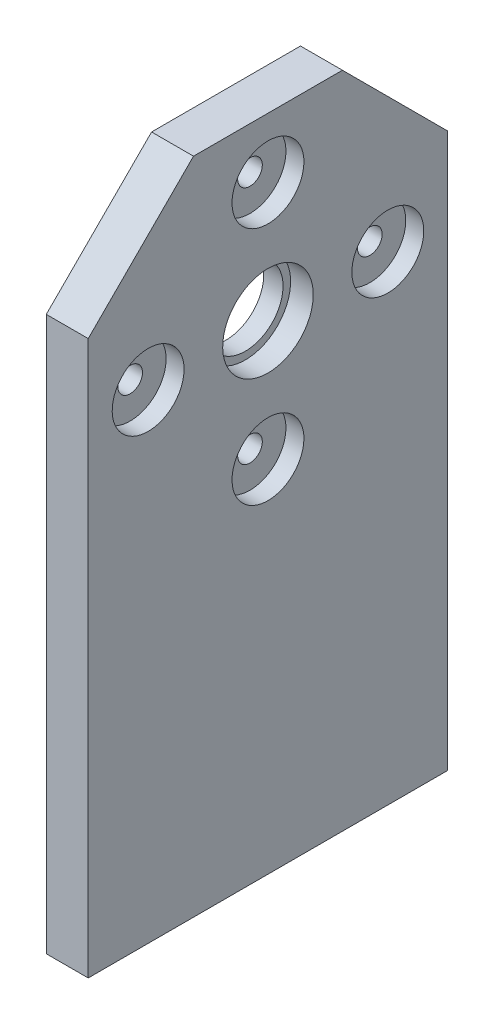
ISO-10303-21;
HEADER;
FILE_DESCRIPTION(('STEP AP214'),'2;1');
FILE_NAME('part.step','',(''),(''),'','','');
FILE_SCHEMA(('AUTOMOTIVE_DESIGN { 1 0 10303 214 1 1 1 1 }'));
ENDSEC;
DATA;
#1=APPLICATION_CONTEXT('core data for automotive mechanical design processes');
#2=APPLICATION_PROTOCOL_DEFINITION('international standard','automotive_design',2000,#1);
#3=PRODUCT_CONTEXT('',#1,'mechanical');
#4=PRODUCT('Part','Part','',(#3));
#5=PRODUCT_RELATED_PRODUCT_CATEGORY('part','',(#4));
#6=PRODUCT_DEFINITION_FORMATION('','',#4);
#7=PRODUCT_DEFINITION_CONTEXT('part definition',#1,'design');
#8=PRODUCT_DEFINITION('design','',#6,#7);
#9=PRODUCT_DEFINITION_SHAPE('','',#8);
#10=(LENGTH_UNIT() NAMED_UNIT(*) SI_UNIT(.MILLI.,.METRE.));
#11=(NAMED_UNIT(*) PLANE_ANGLE_UNIT() SI_UNIT($,.RADIAN.));
#12=(NAMED_UNIT(*) SI_UNIT($,.STERADIAN.) SOLID_ANGLE_UNIT());
#13=UNCERTAINTY_MEASURE_WITH_UNIT(LENGTH_MEASURE(1.E-05),#10,'distance_accuracy_value','');
#14=(GEOMETRIC_REPRESENTATION_CONTEXT(3) GLOBAL_UNCERTAINTY_ASSIGNED_CONTEXT((#13)) GLOBAL_UNIT_ASSIGNED_CONTEXT((#10,
#11,#12)) REPRESENTATION_CONTEXT('',''));
#15=CARTESIAN_POINT('',(0.,0.,0.));
#16=DIRECTION('',(0.,0.,1.));
#17=DIRECTION('',(1.,0.,0.));
#18=AXIS2_PLACEMENT_3D('',#15,#16,#17);
#19=CARTESIAN_POINT('',(-29.15,0.,-11.));
#20=DIRECTION('',(-1.,0.,0.));
#21=DIRECTION('',(0.,0.,-1.));
#22=AXIS2_PLACEMENT_3D('',#19,#20,#21);
#23=PLANE('',#22);
#24=CARTESIAN_POINT('',(-29.15,-31.75,-3.17356640186013E-13));
#25=DIRECTION('',(-1.,0.,0.));
#26=DIRECTION('',(0.,0.,1.));
#27=AXIS2_PLACEMENT_3D('',#24,#25,#26);
#28=CIRCLE('',#27,3.2639);
#29=CARTESIAN_POINT('',(-29.15,-31.75,3.26389999999968));
#30=VERTEX_POINT('',#29);
#31=EDGE_CURVE('E172',#30,#30,#28,.T.);
#32=ORIENTED_EDGE('',*,*,#31,.F.);
#33=EDGE_LOOP('',(#32));
#34=FACE_BOUND('',#33,.T.);
#35=CARTESIAN_POINT('',(-29.15,-1.80042903274088E-13,31.75));
#36=DIRECTION('',(-1.,0.,0.));
#37=DIRECTION('',(0.,0.,1.));
#38=AXIS2_PLACEMENT_3D('',#35,#36,#37);
#39=CIRCLE('',#38,3.2639);
#40=CARTESIAN_POINT('',(-29.15,-1.80042903274088E-13,35.0139));
#41=VERTEX_POINT('',#40);
#42=EDGE_CURVE('E161',#41,#41,#39,.T.);
#43=ORIENTED_EDGE('',*,*,#42,.F.);
#44=EDGE_LOOP('',(#43));
#45=FACE_BOUND('',#44,.T.);
#46=CARTESIAN_POINT('',(-29.15,0.,-31.75));
#47=DIRECTION('',(-1.,0.,0.));
#48=DIRECTION('',(0.,0.,1.));
#49=AXIS2_PLACEMENT_3D('',#46,#47,#48);
#50=CIRCLE('',#49,3.2639);
#51=CARTESIAN_POINT('',(-29.15,0.,-28.4861));
#52=VERTEX_POINT('',#51);
#53=EDGE_CURVE('E156',#52,#52,#50,.T.);
#54=ORIENTED_EDGE('',*,*,#53,.F.);
#55=EDGE_LOOP('',(#54));
#56=FACE_BOUND('',#55,.T.);
#57=CARTESIAN_POINT('',(-29.15,31.75,1.39965040338801E-13));
#58=DIRECTION('',(-1.,0.,0.));
#59=DIRECTION('',(0.,0.,1.));
#60=AXIS2_PLACEMENT_3D('',#57,#58,#59);
#61=CIRCLE('',#60,3.2639);
#62=CARTESIAN_POINT('',(-29.15,31.75,3.26390000000014));
#63=VERTEX_POINT('',#62);
#64=EDGE_CURVE('E152',#63,#63,#61,.T.);
#65=ORIENTED_EDGE('',*,*,#64,.F.);
#66=EDGE_LOOP('',(#65));
#67=FACE_BOUND('',#66,.T.);
#68=CARTESIAN_POINT('',(-29.15,0.,0.));
#69=DIRECTION('',(1.,0.,0.));
#70=DIRECTION('',(0.,1.,0.));
#71=AXIS2_PLACEMENT_3D('',#68,#69,#70);
#72=CIRCLE('',#71,10.);
#73=CARTESIAN_POINT('',(-29.15,10.,0.));
#74=VERTEX_POINT('',#73);
#75=EDGE_CURVE('E165',#74,#74,#72,.T.);
#76=ORIENTED_EDGE('',*,*,#75,.T.);
#77=EDGE_LOOP('',(#76));
#78=FACE_BOUND('',#77,.T.);
#79=DIRECTION('',(0.,0.,-1.));
#80=VECTOR('',#79,1.);
#81=CARTESIAN_POINT('',(-29.15,-127.,-47.625));
#82=LINE('',#81,#80);
#83=CARTESIAN_POINT('',(-29.15,-127.,47.625));
#84=VERTEX_POINT('',#83);
#85=CARTESIAN_POINT('',(-29.15,-127.,-47.6249999999999));
#86=VERTEX_POINT('',#85);
#87=EDGE_CURVE('E50',#84,#86,#82,.T.);
#88=ORIENTED_EDGE('',*,*,#87,.F.);
#89=DIRECTION('',(0.,-1.,0.));
#90=VECTOR('',#89,1.);
#91=CARTESIAN_POINT('',(-29.15,-127.,47.625));
#92=LINE('',#91,#90);
#93=CARTESIAN_POINT('',(-29.15,19.7269209080182,47.625));
#94=VERTEX_POINT('',#93);
#95=EDGE_CURVE('E127',#94,#84,#92,.T.);
#96=ORIENTED_EDGE('',*,*,#95,.F.);
#97=DIRECTION('',(0.,-0.707106781186551,0.707106781186544));
#98=VECTOR('',#97,1.);
#99=CARTESIAN_POINT('',(-29.15,19.7269209080182,47.6249999999999));
#100=LINE('',#99,#98);
#101=CARTESIAN_POINT('',(-29.15,47.6249999999998,19.7269209080187));
#102=VERTEX_POINT('',#101);
#103=EDGE_CURVE('E131',#102,#94,#100,.T.);
#104=ORIENTED_EDGE('',*,*,#103,.F.);
#105=DIRECTION('',(0.,0.,1.));
#106=VECTOR('',#105,1.);
#107=CARTESIAN_POINT('',(-29.15,47.6249999999998,19.7269209080186));
#108=LINE('',#107,#106);
#109=CARTESIAN_POINT('',(-29.15,47.6249999999998,-19.7269209080187));
#110=VERTEX_POINT('',#109);
#111=EDGE_CURVE('E80',#110,#102,#108,.T.);
#112=ORIENTED_EDGE('',*,*,#111,.F.);
#113=DIRECTION('',(0.,0.707106781186551,0.707106781186544));
#114=VECTOR('',#113,1.);
#115=CARTESIAN_POINT('',(-29.15,47.6249999999997,-19.7269209080187));
#116=LINE('',#115,#114);
#117=CARTESIAN_POINT('',(-29.15,19.7269209080182,-47.625));
#118=VERTEX_POINT('',#117);
#119=EDGE_CURVE('E85',#118,#110,#116,.T.);
#120=ORIENTED_EDGE('',*,*,#119,.F.);
#121=DIRECTION('',(0.,1.,0.));
#122=VECTOR('',#121,1.);
#123=CARTESIAN_POINT('',(-29.15,19.7269209080182,-47.625));
#124=LINE('',#123,#122);
#125=EDGE_CURVE('E106',#86,#118,#124,.T.);
#126=ORIENTED_EDGE('',*,*,#125,.F.);
#127=EDGE_LOOP('',(#88,#96,#104,#112,#120,#126));
#128=FACE_BOUND('',#127,.T.);
#129=ADVANCED_FACE('F41',(#34,#45,#56,#67,#78,#128),#23,.T.);
#130=CARTESIAN_POINT('',(-18.0374999999999,0.,0.));
#131=DIRECTION('',(-1.,0.,0.));
#132=DIRECTION('',(0.,0.,1.));
#133=AXIS2_PLACEMENT_3D('',#130,#131,#132);
#134=PLANE('',#133);
#135=CARTESIAN_POINT('',(-18.0374999999999,-1.80042903274088E-13,31.75));
#136=DIRECTION('',(1.,0.,0.));
#137=DIRECTION('',(0.,1.,0.));
#138=AXIS2_PLACEMENT_3D('',#135,#136,#137);
#139=CIRCLE('',#138,9.525);
#140=CARTESIAN_POINT('',(-18.0374999999999,9.52499999999982,31.75));
#141=VERTEX_POINT('',#140);
#142=EDGE_CURVE('E334',#141,#141,#139,.T.);
#143=ORIENTED_EDGE('',*,*,#142,.F.);
#144=EDGE_LOOP('',(#143));
#145=FACE_BOUND('',#144,.T.);
#146=CARTESIAN_POINT('',(-18.0374999999999,31.75,1.32275707701698E-13));
#147=DIRECTION('',(1.,0.,0.));
#148=DIRECTION('',(0.,1.,0.));
#149=AXIS2_PLACEMENT_3D('',#146,#147,#148);
#150=CIRCLE('',#149,9.525);
#151=CARTESIAN_POINT('',(-18.0374999999999,41.275,1.32275707701698E-13));
#152=VERTEX_POINT('',#151);
#153=EDGE_CURVE('E337',#152,#152,#150,.T.);
#154=ORIENTED_EDGE('',*,*,#153,.F.);
#155=EDGE_LOOP('',(#154));
#156=FACE_BOUND('',#155,.T.);
#157=CARTESIAN_POINT('',(-18.0374999999999,0.,-31.75));
#158=DIRECTION('',(1.,0.,0.));
#159=DIRECTION('',(0.,1.,0.));
#160=AXIS2_PLACEMENT_3D('',#157,#158,#159);
#161=CIRCLE('',#160,9.525);
#162=CARTESIAN_POINT('',(-18.0374999999999,9.52500000000006,-31.75));
#163=VERTEX_POINT('',#162);
#164=EDGE_CURVE('E343',#163,#163,#161,.T.);
#165=ORIENTED_EDGE('',*,*,#164,.F.);
#166=EDGE_LOOP('',(#165));
#167=FACE_BOUND('',#166,.T.);
#168=CARTESIAN_POINT('',(-18.0374999999999,-31.75,-3.25045972823115E-13));
#169=DIRECTION('',(1.,0.,0.));
#170=DIRECTION('',(0.,1.,0.));
#171=AXIS2_PLACEMENT_3D('',#168,#169,#170);
#172=CIRCLE('',#171,9.525);
#173=CARTESIAN_POINT('',(-18.0374999999999,-22.225,-3.25045972823115E-13));
#174=VERTEX_POINT('',#173);
#175=EDGE_CURVE('E349',#174,#174,#172,.T.);
#176=ORIENTED_EDGE('',*,*,#175,.F.);
#177=EDGE_LOOP('',(#176));
#178=FACE_BOUND('',#177,.T.);
#179=CARTESIAN_POINT('',(-18.0374999999999,0.,0.));
#180=DIRECTION('',(1.,0.,0.));
#181=DIRECTION('',(0.,1.,0.));
#182=AXIS2_PLACEMENT_3D('',#179,#180,#181);
#183=CIRCLE('',#182,12.);
#184=CARTESIAN_POINT('',(-18.0374999999999,12.,0.));
#185=VERTEX_POINT('',#184);
#186=EDGE_CURVE('E168',#185,#185,#183,.T.);
#187=ORIENTED_EDGE('',*,*,#186,.F.);
#188=EDGE_LOOP('',(#187));
#189=FACE_BOUND('',#188,.T.);
#190=DIRECTION('',(0.,0.,-1.));
#191=VECTOR('',#190,1.);
#192=CARTESIAN_POINT('',(-18.0374999999999,-127.,-47.6249999999999));
#193=LINE('',#192,#191);
#194=CARTESIAN_POINT('',(-18.0374999999999,-127.,47.625));
#195=VERTEX_POINT('',#194);
#196=CARTESIAN_POINT('',(-18.0374999999999,-127.,-47.6249999999999));
#197=VERTEX_POINT('',#196);
#198=EDGE_CURVE('E117',#195,#197,#193,.T.);
#199=ORIENTED_EDGE('',*,*,#198,.T.);
#200=DIRECTION('',(0.,1.,0.));
#201=VECTOR('',#200,1.);
#202=CARTESIAN_POINT('',(-18.0374999999999,19.7269209080182,-47.625));
#203=LINE('',#202,#201);
#204=CARTESIAN_POINT('',(-18.0374999999999,19.7269209080182,-47.625));
#205=VERTEX_POINT('',#204);
#206=EDGE_CURVE('E104',#197,#205,#203,.T.);
#207=ORIENTED_EDGE('',*,*,#206,.T.);
#208=DIRECTION('',(0.,0.707106781186551,0.707106781186544));
#209=VECTOR('',#208,1.);
#210=CARTESIAN_POINT('',(-18.0374999999999,47.6249999999998,-19.7269209080187));
#211=LINE('',#210,#209);
#212=CARTESIAN_POINT('',(-18.0374999999999,47.6249999999998,-19.7269209080187));
#213=VERTEX_POINT('',#212);
#214=EDGE_CURVE('E109',#205,#213,#211,.T.);
#215=ORIENTED_EDGE('',*,*,#214,.T.);
#216=DIRECTION('',(0.,0.,1.));
#217=VECTOR('',#216,1.);
#218=CARTESIAN_POINT('',(-18.0374999999999,47.6249999999998,19.7269209080187));
#219=LINE('',#218,#217);
#220=CARTESIAN_POINT('',(-18.0374999999999,47.6249999999998,19.7269209080187));
#221=VERTEX_POINT('',#220);
#222=EDGE_CURVE('E113',#213,#221,#219,.T.);
#223=ORIENTED_EDGE('',*,*,#222,.T.);
#224=DIRECTION('',(0.,-0.707106781186551,0.707106781186544));
#225=VECTOR('',#224,1.);
#226=CARTESIAN_POINT('',(-18.0374999999999,19.7269209080182,47.625));
#227=LINE('',#226,#225);
#228=CARTESIAN_POINT('',(-18.0374999999999,19.7269209080182,47.625));
#229=VERTEX_POINT('',#228);
#230=EDGE_CURVE('E178',#221,#229,#227,.T.);
#231=ORIENTED_EDGE('',*,*,#230,.T.);
#232=DIRECTION('',(0.,-1.,0.));
#233=VECTOR('',#232,1.);
#234=CARTESIAN_POINT('',(-18.0374999999999,-127.,47.625));
#235=LINE('',#234,#233);
#236=EDGE_CURVE('E124',#229,#195,#235,.T.);
#237=ORIENTED_EDGE('',*,*,#236,.T.);
#238=EDGE_LOOP('',(#199,#207,#215,#223,#231,#237));
#239=FACE_BOUND('',#238,.T.);
#240=ADVANCED_FACE('F115',(#145,#156,#167,#178,#189,#239),#134,.F.);
#241=CARTESIAN_POINT('',(-228.063179867499,19.7269209080182,-47.625));
#242=DIRECTION('',(0.,0.,-1.));
#243=DIRECTION('',(0.,1.,0.));
#244=AXIS2_PLACEMENT_3D('',#241,#242,#243);
#245=PLANE('',#244);
#246=DIRECTION('',(1.,0.,0.));
#247=VECTOR('',#246,1.);
#248=CARTESIAN_POINT('',(-228.063179867499,-127.,-47.6249999999999));
#249=LINE('',#248,#247);
#250=EDGE_CURVE('E12',#86,#197,#249,.T.);
#251=ORIENTED_EDGE('',*,*,#250,.F.);
#252=ORIENTED_EDGE('',*,*,#125,.T.);
#253=DIRECTION('',(1.,0.,0.));
#254=VECTOR('',#253,1.);
#255=CARTESIAN_POINT('',(-228.063179867499,19.7269209080182,-47.625));
#256=LINE('',#255,#254);
#257=EDGE_CURVE('E101',#118,#205,#256,.T.);
#258=ORIENTED_EDGE('',*,*,#257,.T.);
#259=ORIENTED_EDGE('',*,*,#206,.F.);
#260=EDGE_LOOP('',(#251,#252,#258,#259));
#261=FACE_BOUND('',#260,.T.);
#262=ADVANCED_FACE('F102',(#261),#245,.T.);
#263=CARTESIAN_POINT('',(-228.063179867499,47.6249999999998,-19.7269209080187));
#264=DIRECTION('',(0.,0.707106781186544,-0.707106781186551));
#265=DIRECTION('',(0.,0.707106781186551,0.707106781186544));
#266=AXIS2_PLACEMENT_3D('',#263,#264,#265);
#267=PLANE('',#266);
#268=ORIENTED_EDGE('',*,*,#257,.F.);
#269=ORIENTED_EDGE('',*,*,#119,.T.);
#270=DIRECTION('',(1.,0.,0.));
#271=VECTOR('',#270,1.);
#272=CARTESIAN_POINT('',(-228.063179867499,47.6249999999998,-19.7269209080187));
#273=LINE('',#272,#271);
#274=EDGE_CURVE('E96',#110,#213,#273,.T.);
#275=ORIENTED_EDGE('',*,*,#274,.T.);
#276=ORIENTED_EDGE('',*,*,#214,.F.);
#277=EDGE_LOOP('',(#268,#269,#275,#276));
#278=FACE_BOUND('',#277,.T.);
#279=ADVANCED_FACE('F110',(#278),#267,.T.);
#280=CARTESIAN_POINT('',(-228.063179867499,47.6249999999998,19.7269209080187));
#281=DIRECTION('',(0.,1.,0.));
#282=DIRECTION('',(-1.,0.,0.));
#283=AXIS2_PLACEMENT_3D('',#280,#281,#282);
#284=PLANE('',#283);
#285=ORIENTED_EDGE('',*,*,#274,.F.);
#286=ORIENTED_EDGE('',*,*,#111,.T.);
#287=DIRECTION('',(1.,0.,0.));
#288=VECTOR('',#287,1.);
#289=CARTESIAN_POINT('',(-228.063179867499,47.6249999999998,19.7269209080187));
#290=LINE('',#289,#288);
#291=EDGE_CURVE('E134',#102,#221,#290,.T.);
#292=ORIENTED_EDGE('',*,*,#291,.T.);
#293=ORIENTED_EDGE('',*,*,#222,.F.);
#294=EDGE_LOOP('',(#285,#286,#292,#293));
#295=FACE_BOUND('',#294,.T.);
#296=ADVANCED_FACE('F183',(#295),#284,.T.);
#297=CARTESIAN_POINT('',(-228.063179867499,19.7269209080182,47.625));
#298=DIRECTION('',(0.,0.707106781186544,0.707106781186551));
#299=DIRECTION('',(0.,-0.707106781186551,0.707106781186544));
#300=AXIS2_PLACEMENT_3D('',#297,#298,#299);
#301=PLANE('',#300);
#302=ORIENTED_EDGE('',*,*,#291,.F.);
#303=ORIENTED_EDGE('',*,*,#103,.T.);
#304=DIRECTION('',(1.,0.,0.));
#305=VECTOR('',#304,1.);
#306=CARTESIAN_POINT('',(-228.063179867499,19.7269209080182,47.625));
#307=LINE('',#306,#305);
#308=EDGE_CURVE('E130',#94,#229,#307,.T.);
#309=ORIENTED_EDGE('',*,*,#308,.T.);
#310=ORIENTED_EDGE('',*,*,#230,.F.);
#311=EDGE_LOOP('',(#302,#303,#309,#310));
#312=FACE_BOUND('',#311,.T.);
#313=ADVANCED_FACE('F186',(#312),#301,.T.);
#314=CARTESIAN_POINT('',(-228.063179867499,-127.,47.625));
#315=DIRECTION('',(0.,0.,1.));
#316=DIRECTION('',(1.,0.,0.));
#317=AXIS2_PLACEMENT_3D('',#314,#315,#316);
#318=PLANE('',#317);
#319=ORIENTED_EDGE('',*,*,#308,.F.);
#320=ORIENTED_EDGE('',*,*,#95,.T.);
#321=DIRECTION('',(1.,0.,0.));
#322=VECTOR('',#321,1.);
#323=CARTESIAN_POINT('',(-228.063179867499,-127.,47.625));
#324=LINE('',#323,#322);
#325=EDGE_CURVE('E126',#84,#195,#324,.T.);
#326=ORIENTED_EDGE('',*,*,#325,.T.);
#327=ORIENTED_EDGE('',*,*,#236,.F.);
#328=EDGE_LOOP('',(#319,#320,#326,#327));
#329=FACE_BOUND('',#328,.T.);
#330=ADVANCED_FACE('F189',(#329),#318,.T.);
#331=CARTESIAN_POINT('',(-228.063179867499,-127.,-47.6249999999999));
#332=DIRECTION('',(0.,-1.,0.));
#333=DIRECTION('',(1.,0.,0.));
#334=AXIS2_PLACEMENT_3D('',#331,#332,#333);
#335=PLANE('',#334);
#336=CARTESIAN_POINT('',(-23.5937499999999,-127.,-38.1));
#337=DIRECTION('',(0.,-1.,0.));
#338=DIRECTION('',(1.,0.,0.));
#339=AXIS2_PLACEMENT_3D('',#336,#337,#338);
#340=CIRCLE('',#339,2.77812499999999);
#341=CARTESIAN_POINT('',(-20.8156249999999,-127.,-38.1));
#342=VERTEX_POINT('',#341);
#343=EDGE_CURVE('E323',#342,#342,#340,.T.);
#344=ORIENTED_EDGE('',*,*,#343,.F.);
#345=EDGE_LOOP('',(#344));
#346=FACE_BOUND('',#345,.T.);
#347=CARTESIAN_POINT('',(-23.59375,-127.,38.1));
#348=DIRECTION('',(0.,-1.,0.));
#349=DIRECTION('',(1.,0.,0.));
#350=AXIS2_PLACEMENT_3D('',#347,#348,#349);
#351=CIRCLE('',#350,2.77812499999999);
#352=CARTESIAN_POINT('',(-20.815625,-127.,38.1));
#353=VERTEX_POINT('',#352);
#354=EDGE_CURVE('E317',#353,#353,#351,.T.);
#355=ORIENTED_EDGE('',*,*,#354,.F.);
#356=EDGE_LOOP('',(#355));
#357=FACE_BOUND('',#356,.T.);
#358=CARTESIAN_POINT('',(-23.59375,-127.,0.));
#359=DIRECTION('',(0.,-1.,0.));
#360=DIRECTION('',(1.,0.,0.));
#361=AXIS2_PLACEMENT_3D('',#358,#359,#360);
#362=CIRCLE('',#361,2.778125);
#363=CARTESIAN_POINT('',(-20.815625,-127.,0.));
#364=VERTEX_POINT('',#363);
#365=EDGE_CURVE('E318',#364,#364,#362,.T.);
#366=ORIENTED_EDGE('',*,*,#365,.F.);
#367=EDGE_LOOP('',(#366));
#368=FACE_BOUND('',#367,.T.);
#369=ORIENTED_EDGE('',*,*,#325,.F.);
#370=ORIENTED_EDGE('',*,*,#87,.T.);
#371=ORIENTED_EDGE('',*,*,#250,.T.);
#372=ORIENTED_EDGE('',*,*,#198,.F.);
#373=EDGE_LOOP('',(#369,#370,#371,#372));
#374=FACE_BOUND('',#373,.T.);
#375=ADVANCED_FACE('F191',(#346,#357,#368,#374),#335,.T.);
#376=CARTESIAN_POINT('',(-24.0374999999999,0.,0.));
#377=DIRECTION('',(1.,0.,0.));
#378=DIRECTION('',(0.,1.,0.));
#379=AXIS2_PLACEMENT_3D('',#376,#377,#378);
#380=CYLINDRICAL_SURFACE('',#379,12.);
#381=CARTESIAN_POINT('',(-24.0374999999999,0.,0.));
#382=DIRECTION('',(1.,0.,0.));
#383=DIRECTION('',(0.,1.,0.));
#384=AXIS2_PLACEMENT_3D('',#381,#382,#383);
#385=CIRCLE('',#384,12.);
#386=CARTESIAN_POINT('',(-24.0374999999999,12.,0.));
#387=VERTEX_POINT('',#386);
#388=EDGE_CURVE('E119',#387,#387,#385,.T.);
#389=ORIENTED_EDGE('',*,*,#388,.F.);
#390=EDGE_LOOP('',(#389));
#391=FACE_BOUND('',#390,.T.);
#392=ORIENTED_EDGE('',*,*,#186,.T.);
#393=EDGE_LOOP('',(#392));
#394=FACE_BOUND('',#393,.T.);
#395=ADVANCED_FACE('F193',(#391,#394),#380,.F.);
#396=CARTESIAN_POINT('',(-24.0374999999999,0.,0.));
#397=DIRECTION('',(1.,0.,0.));
#398=DIRECTION('',(0.,1.,0.));
#399=AXIS2_PLACEMENT_3D('',#396,#397,#398);
#400=PLANE('',#399);
#401=CARTESIAN_POINT('',(-24.0374999999999,0.,0.));
#402=DIRECTION('',(1.,0.,0.));
#403=DIRECTION('',(0.,1.,0.));
#404=AXIS2_PLACEMENT_3D('',#401,#402,#403);
#405=CIRCLE('',#404,10.);
#406=CARTESIAN_POINT('',(-24.0374999999999,10.,0.));
#407=VERTEX_POINT('',#406);
#408=EDGE_CURVE('E169',#407,#407,#405,.T.);
#409=ORIENTED_EDGE('',*,*,#408,.F.);
#410=EDGE_LOOP('',(#409));
#411=FACE_BOUND('',#410,.T.);
#412=ORIENTED_EDGE('',*,*,#388,.T.);
#413=EDGE_LOOP('',(#412));
#414=FACE_BOUND('',#413,.T.);
#415=ADVANCED_FACE('F201',(#411,#414),#400,.T.);
#416=CARTESIAN_POINT('',(-29.15,0.,0.));
#417=DIRECTION('',(1.,0.,0.));
#418=DIRECTION('',(0.,1.,0.));
#419=AXIS2_PLACEMENT_3D('',#416,#417,#418);
#420=CYLINDRICAL_SURFACE('',#419,10.);
#421=ORIENTED_EDGE('',*,*,#75,.F.);
#422=EDGE_LOOP('',(#421));
#423=FACE_BOUND('',#422,.T.);
#424=ORIENTED_EDGE('',*,*,#408,.T.);
#425=EDGE_LOOP('',(#424));
#426=FACE_BOUND('',#425,.T.);
#427=ADVANCED_FACE('F227',(#423,#426),#420,.F.);
#428=CARTESIAN_POINT('',(-18.0374999999999,31.75,1.34582507492829E-13));
#429=DIRECTION('',(-1.,0.,0.));
#430=DIRECTION('',(0.,0.,1.));
#431=AXIS2_PLACEMENT_3D('',#428,#429,#430);
#432=CYLINDRICAL_SURFACE('',#431,3.2639);
#433=CARTESIAN_POINT('',(-22.8,31.75,1.3688930728396E-13));
#434=DIRECTION('',(-1.,0.,0.));
#435=DIRECTION('',(0.,0.,1.));
#436=AXIS2_PLACEMENT_3D('',#433,#434,#435);
#437=CIRCLE('',#436,3.2639);
#438=CARTESIAN_POINT('',(-22.8,31.75,3.26390000000014));
#439=VERTEX_POINT('',#438);
#440=EDGE_CURVE('E44',#439,#439,#437,.F.);
#441=ORIENTED_EDGE('',*,*,#440,.T.);
#442=EDGE_LOOP('',(#441));
#443=FACE_BOUND('',#442,.T.);
#444=ORIENTED_EDGE('',*,*,#64,.T.);
#445=EDGE_LOOP('',(#444));
#446=FACE_BOUND('',#445,.T.);
#447=ADVANCED_FACE('F229',(#443,#446),#432,.F.);
#448=CARTESIAN_POINT('',(-18.0374999999999,0.,-31.75));
#449=DIRECTION('',(-1.,0.,0.));
#450=DIRECTION('',(0.,0.,1.));
#451=AXIS2_PLACEMENT_3D('',#448,#449,#450);
#452=CYLINDRICAL_SURFACE('',#451,3.2639);
#453=CARTESIAN_POINT('',(-22.8,0.,-31.75));
#454=DIRECTION('',(-1.,0.,0.));
#455=DIRECTION('',(0.,0.,1.));
#456=AXIS2_PLACEMENT_3D('',#453,#454,#455);
#457=CIRCLE('',#456,3.2639);
#458=CARTESIAN_POINT('',(-22.8,0.,-28.4861));
#459=VERTEX_POINT('',#458);
#460=EDGE_CURVE('E147',#459,#459,#457,.F.);
#461=ORIENTED_EDGE('',*,*,#460,.T.);
#462=EDGE_LOOP('',(#461));
#463=FACE_BOUND('',#462,.T.);
#464=ORIENTED_EDGE('',*,*,#53,.T.);
#465=EDGE_LOOP('',(#464));
#466=FACE_BOUND('',#465,.T.);
#467=ADVANCED_FACE('F245',(#463,#466),#452,.F.);
#468=CARTESIAN_POINT('',(-18.0374999999999,-1.80042903274088E-13,31.75));
#469=DIRECTION('',(-1.,0.,0.));
#470=DIRECTION('',(0.,0.,1.));
#471=AXIS2_PLACEMENT_3D('',#468,#469,#470);
#472=CYLINDRICAL_SURFACE('',#471,3.2639);
#473=CARTESIAN_POINT('',(-22.8,-1.80042903274088E-13,31.75));
#474=DIRECTION('',(-1.,0.,0.));
#475=DIRECTION('',(0.,0.,1.));
#476=AXIS2_PLACEMENT_3D('',#473,#474,#475);
#477=CIRCLE('',#476,3.2639);
#478=CARTESIAN_POINT('',(-22.8,-1.80042903274088E-13,35.0139));
#479=VERTEX_POINT('',#478);
#480=EDGE_CURVE('E144',#479,#479,#477,.F.);
#481=ORIENTED_EDGE('',*,*,#480,.T.);
#482=EDGE_LOOP('',(#481));
#483=FACE_BOUND('',#482,.T.);
#484=ORIENTED_EDGE('',*,*,#42,.T.);
#485=EDGE_LOOP('',(#484));
#486=FACE_BOUND('',#485,.T.);
#487=ADVANCED_FACE('F248',(#483,#486),#472,.F.);
#488=CARTESIAN_POINT('',(-18.0374999999999,-31.75,-3.22739173031985E-13));
#489=DIRECTION('',(-1.,0.,0.));
#490=DIRECTION('',(0.,0.,1.));
#491=AXIS2_PLACEMENT_3D('',#488,#489,#490);
#492=CYLINDRICAL_SURFACE('',#491,3.2639);
#493=CARTESIAN_POINT('',(-22.8,-31.75,-3.20432373240854E-13));
#494=DIRECTION('',(-1.,0.,0.));
#495=DIRECTION('',(0.,0.,1.));
#496=AXIS2_PLACEMENT_3D('',#493,#494,#495);
#497=CIRCLE('',#496,3.2639);
#498=CARTESIAN_POINT('',(-22.8,-31.75,3.26389999999968));
#499=VERTEX_POINT('',#498);
#500=EDGE_CURVE('E141',#499,#499,#497,.F.);
#501=ORIENTED_EDGE('',*,*,#500,.T.);
#502=EDGE_LOOP('',(#501));
#503=FACE_BOUND('',#502,.T.);
#504=ORIENTED_EDGE('',*,*,#31,.T.);
#505=EDGE_LOOP('',(#504));
#506=FACE_BOUND('',#505,.T.);
#507=ADVANCED_FACE('F251',(#503,#506),#492,.F.);
#508=CARTESIAN_POINT('',(-22.8,0.,-11.));
#509=DIRECTION('',(-1.,0.,0.));
#510=DIRECTION('',(0.,0.,-1.));
#511=AXIS2_PLACEMENT_3D('',#508,#509,#510);
#512=PLANE('',#511);
#513=CARTESIAN_POINT('',(-22.8,-31.75,-3.25045972823115E-13));
#514=DIRECTION('',(-1.,0.,0.));
#515=DIRECTION('',(0.,0.,1.));
#516=AXIS2_PLACEMENT_3D('',#513,#514,#515);
#517=CIRCLE('',#516,9.525);
#518=CARTESIAN_POINT('',(-22.8,-31.75,9.52499999999968));
#519=VERTEX_POINT('',#518);
#520=EDGE_CURVE('E332',#519,#519,#517,.F.);
#521=ORIENTED_EDGE('',*,*,#520,.T.);
#522=EDGE_LOOP('',(#521));
#523=FACE_BOUND('',#522,.T.);
#524=ORIENTED_EDGE('',*,*,#500,.F.);
#525=EDGE_LOOP('',(#524));
#526=FACE_BOUND('',#525,.T.);
#527=ADVANCED_FACE('F255',(#523,#526),#512,.F.);
#528=CARTESIAN_POINT('',(-56.0907683632075,-31.75,-3.25045972823115E-13));
#529=DIRECTION('',(1.,0.,0.));
#530=DIRECTION('',(0.,1.,0.));
#531=AXIS2_PLACEMENT_3D('',#528,#529,#530);
#532=CYLINDRICAL_SURFACE('',#531,9.525);
#533=ORIENTED_EDGE('',*,*,#175,.T.);
#534=EDGE_LOOP('',(#533));
#535=FACE_BOUND('',#534,.T.);
#536=ORIENTED_EDGE('',*,*,#520,.F.);
#537=EDGE_LOOP('',(#536));
#538=FACE_BOUND('',#537,.T.);
#539=ADVANCED_FACE('F257',(#535,#538),#532,.F.);
#540=CARTESIAN_POINT('',(-22.8,0.,-11.));
#541=DIRECTION('',(-1.,0.,0.));
#542=DIRECTION('',(0.,0.,-1.));
#543=AXIS2_PLACEMENT_3D('',#540,#541,#542);
#544=PLANE('',#543);
#545=CARTESIAN_POINT('',(-22.8,-1.80042903274088E-13,31.75));
#546=DIRECTION('',(-1.,0.,0.));
#547=DIRECTION('',(0.,0.,1.));
#548=AXIS2_PLACEMENT_3D('',#545,#546,#547);
#549=CIRCLE('',#548,9.525);
#550=CARTESIAN_POINT('',(-22.8,-1.80042903274088E-13,41.275));
#551=VERTEX_POINT('',#550);
#552=EDGE_CURVE('E145',#551,#551,#549,.F.);
#553=ORIENTED_EDGE('',*,*,#552,.T.);
#554=EDGE_LOOP('',(#553));
#555=FACE_BOUND('',#554,.T.);
#556=ORIENTED_EDGE('',*,*,#480,.F.);
#557=EDGE_LOOP('',(#556));
#558=FACE_BOUND('',#557,.T.);
#559=ADVANCED_FACE('F260',(#555,#558),#544,.F.);
#560=CARTESIAN_POINT('',(-56.0907683632075,-1.80042903274088E-13,31.75));
#561=DIRECTION('',(1.,0.,0.));
#562=DIRECTION('',(0.,1.,0.));
#563=AXIS2_PLACEMENT_3D('',#560,#561,#562);
#564=CYLINDRICAL_SURFACE('',#563,9.525);
#565=ORIENTED_EDGE('',*,*,#142,.T.);
#566=EDGE_LOOP('',(#565));
#567=FACE_BOUND('',#566,.T.);
#568=ORIENTED_EDGE('',*,*,#552,.F.);
#569=EDGE_LOOP('',(#568));
#570=FACE_BOUND('',#569,.T.);
#571=ADVANCED_FACE('F273',(#567,#570),#564,.F.);
#572=CARTESIAN_POINT('',(-22.8,0.,-11.));
#573=DIRECTION('',(-1.,0.,0.));
#574=DIRECTION('',(0.,0.,-1.));
#575=AXIS2_PLACEMENT_3D('',#572,#573,#574);
#576=PLANE('',#575);
#577=CARTESIAN_POINT('',(-22.8,0.,-31.75));
#578=DIRECTION('',(-1.,0.,0.));
#579=DIRECTION('',(0.,0.,1.));
#580=AXIS2_PLACEMENT_3D('',#577,#578,#579);
#581=CIRCLE('',#580,9.525);
#582=CARTESIAN_POINT('',(-22.8,0.,-22.225));
#583=VERTEX_POINT('',#582);
#584=EDGE_CURVE('E346',#583,#583,#581,.F.);
#585=ORIENTED_EDGE('',*,*,#584,.T.);
#586=EDGE_LOOP('',(#585));
#587=FACE_BOUND('',#586,.T.);
#588=ORIENTED_EDGE('',*,*,#460,.F.);
#589=EDGE_LOOP('',(#588));
#590=FACE_BOUND('',#589,.T.);
#591=ADVANCED_FACE('F269',(#587,#590),#576,.F.);
#592=CARTESIAN_POINT('',(-56.0907683632075,0.,-31.75));
#593=DIRECTION('',(1.,0.,0.));
#594=DIRECTION('',(0.,1.,0.));
#595=AXIS2_PLACEMENT_3D('',#592,#593,#594);
#596=CYLINDRICAL_SURFACE('',#595,9.525);
#597=ORIENTED_EDGE('',*,*,#164,.T.);
#598=EDGE_LOOP('',(#597));
#599=FACE_BOUND('',#598,.T.);
#600=ORIENTED_EDGE('',*,*,#584,.F.);
#601=EDGE_LOOP('',(#600));
#602=FACE_BOUND('',#601,.T.);
#603=ADVANCED_FACE('F265',(#599,#602),#596,.F.);
#604=CARTESIAN_POINT('',(-22.8,0.,-11.));
#605=DIRECTION('',(-1.,0.,0.));
#606=DIRECTION('',(0.,0.,-1.));
#607=AXIS2_PLACEMENT_3D('',#604,#605,#606);
#608=PLANE('',#607);
#609=CARTESIAN_POINT('',(-22.8,31.75,1.32275707701698E-13));
#610=DIRECTION('',(-1.,0.,0.));
#611=DIRECTION('',(0.,0.,1.));
#612=AXIS2_PLACEMENT_3D('',#609,#610,#611);
#613=CIRCLE('',#612,9.525);
#614=CARTESIAN_POINT('',(-22.8,31.75,9.52500000000013));
#615=VERTEX_POINT('',#614);
#616=EDGE_CURVE('E340',#615,#615,#613,.F.);
#617=ORIENTED_EDGE('',*,*,#616,.T.);
#618=EDGE_LOOP('',(#617));
#619=FACE_BOUND('',#618,.T.);
#620=ORIENTED_EDGE('',*,*,#440,.F.);
#621=EDGE_LOOP('',(#620));
#622=FACE_BOUND('',#621,.T.);
#623=ADVANCED_FACE('F268',(#619,#622),#608,.F.);
#624=CARTESIAN_POINT('',(-56.0907683632075,31.75,1.32275707701698E-13));
#625=DIRECTION('',(1.,0.,0.));
#626=DIRECTION('',(0.,1.,0.));
#627=AXIS2_PLACEMENT_3D('',#624,#625,#626);
#628=CYLINDRICAL_SURFACE('',#627,9.525);
#629=ORIENTED_EDGE('',*,*,#153,.T.);
#630=EDGE_LOOP('',(#629));
#631=FACE_BOUND('',#630,.T.);
#632=ORIENTED_EDGE('',*,*,#616,.F.);
#633=EDGE_LOOP('',(#632));
#634=FACE_BOUND('',#633,.T.);
#635=ADVANCED_FACE('F275',(#631,#634),#628,.F.);
#636=CARTESIAN_POINT('',(-23.59375,-88.9,0.));
#637=DIRECTION('',(0.,-1.,0.));
#638=DIRECTION('',(1.,0.,0.));
#639=AXIS2_PLACEMENT_3D('',#636,#637,#638);
#640=CYLINDRICAL_SURFACE('',#639,2.778125);
#641=CARTESIAN_POINT('',(-23.59375,-88.9,0.));
#642=DIRECTION('',(0.,-1.,0.));
#643=DIRECTION('',(1.,0.,0.));
#644=AXIS2_PLACEMENT_3D('',#641,#642,#643);
#645=CIRCLE('',#644,2.778125);
#646=CARTESIAN_POINT('',(-20.815625,-88.9,0.));
#647=VERTEX_POINT('',#646);
#648=EDGE_CURVE('E321',#647,#647,#645,.T.);
#649=CARTESIAN_POINT('',(-20.815625,-88.9,0.));
#650=CARTESIAN_POINT('',(-20.815625,-89.296875,0.));
#651=CARTESIAN_POINT('',(-20.815625,-89.69375,0.));
#652=CARTESIAN_POINT('',(-20.815625,-90.4875,0.));
#653=CARTESIAN_POINT('',(-20.815625,-90.884375,0.));
#654=CARTESIAN_POINT('',(-20.815625,-91.678125,0.));
#655=CARTESIAN_POINT('',(-20.815625,-92.075,0.));
#656=CARTESIAN_POINT('',(-20.815625,-92.86875,0.));
#657=CARTESIAN_POINT('',(-20.815625,-93.265625,0.));
#658=CARTESIAN_POINT('',(-20.815625,-94.059375,0.));
#659=CARTESIAN_POINT('',(-20.815625,-94.45625,0.));
#660=CARTESIAN_POINT('',(-20.815625,-95.25,0.));
#661=CARTESIAN_POINT('',(-20.815625,-95.646875,0.));
#662=CARTESIAN_POINT('',(-20.815625,-96.440625,0.));
#663=CARTESIAN_POINT('',(-20.815625,-96.8375,0.));
#664=CARTESIAN_POINT('',(-20.815625,-97.63125,0.));
#665=CARTESIAN_POINT('',(-20.815625,-98.028125,0.));
#666=CARTESIAN_POINT('',(-20.815625,-98.821875,0.));
#667=CARTESIAN_POINT('',(-20.815625,-99.21875,0.));
#668=CARTESIAN_POINT('',(-20.815625,-100.0125,0.));
#669=CARTESIAN_POINT('',(-20.815625,-100.409375,0.));
#670=CARTESIAN_POINT('',(-20.815625,-101.203125,0.));
#671=CARTESIAN_POINT('',(-20.815625,-101.6,0.));
#672=CARTESIAN_POINT('',(-20.815625,-102.39375,0.));
#673=CARTESIAN_POINT('',(-20.815625,-102.790625,0.));
#674=CARTESIAN_POINT('',(-20.815625,-103.584375,0.));
#675=CARTESIAN_POINT('',(-20.815625,-103.98125,0.));
#676=CARTESIAN_POINT('',(-20.815625,-104.775,0.));
#677=CARTESIAN_POINT('',(-20.815625,-105.171875,0.));
#678=CARTESIAN_POINT('',(-20.815625,-105.965625,0.));
#679=CARTESIAN_POINT('',(-20.815625,-106.3625,0.));
#680=CARTESIAN_POINT('',(-20.815625,-107.15625,0.));
#681=CARTESIAN_POINT('',(-20.815625,-107.553125,0.));
#682=CARTESIAN_POINT('',(-20.815625,-108.346875,0.));
#683=CARTESIAN_POINT('',(-20.815625,-108.74375,0.));
#684=CARTESIAN_POINT('',(-20.815625,-109.5375,0.));
#685=CARTESIAN_POINT('',(-20.815625,-109.934375,0.));
#686=CARTESIAN_POINT('',(-20.815625,-110.728125,0.));
#687=CARTESIAN_POINT('',(-20.815625,-111.125,0.));
#688=CARTESIAN_POINT('',(-20.815625,-111.91875,0.));
#689=CARTESIAN_POINT('',(-20.815625,-112.315625,0.));
#690=CARTESIAN_POINT('',(-20.815625,-113.109375,0.));
#691=CARTESIAN_POINT('',(-20.815625,-113.50625,0.));
#692=CARTESIAN_POINT('',(-20.815625,-114.3,0.));
#693=CARTESIAN_POINT('',(-20.815625,-114.696875,0.));
#694=CARTESIAN_POINT('',(-20.815625,-115.490625,0.));
#695=CARTESIAN_POINT('',(-20.815625,-115.8875,0.));
#696=CARTESIAN_POINT('',(-20.815625,-116.68125,0.));
#697=CARTESIAN_POINT('',(-20.815625,-117.078125,0.));
#698=CARTESIAN_POINT('',(-20.815625,-117.871875,0.));
#699=CARTESIAN_POINT('',(-20.815625,-118.26875,0.));
#700=CARTESIAN_POINT('',(-20.815625,-119.0625,0.));
#701=CARTESIAN_POINT('',(-20.815625,-119.459375,0.));
#702=CARTESIAN_POINT('',(-20.815625,-120.253125,0.));
#703=CARTESIAN_POINT('',(-20.815625,-120.65,0.));
#704=CARTESIAN_POINT('',(-20.815625,-121.44375,0.));
#705=CARTESIAN_POINT('',(-20.815625,-121.840625,0.));
#706=CARTESIAN_POINT('',(-20.815625,-122.634375,0.));
#707=CARTESIAN_POINT('',(-20.815625,-123.03125,0.));
#708=CARTESIAN_POINT('',(-20.815625,-123.825,0.));
#709=CARTESIAN_POINT('',(-20.815625,-124.221875,0.));
#710=CARTESIAN_POINT('',(-20.815625,-125.015625,0.));
#711=CARTESIAN_POINT('',(-20.815625,-125.4125,0.));
#712=CARTESIAN_POINT('',(-20.815625,-126.20625,0.));
#713=CARTESIAN_POINT('',(-20.815625,-126.603125,0.));
#714=CARTESIAN_POINT('',(-20.815625,-127.,0.));
#715=B_SPLINE_CURVE_WITH_KNOTS('',3,(#649,#650,#651,#652,#653,#654,#655,#656,#657,#658,#659,
#660,#661,#662,#663,#664,#665,#666,#667,#668,#669,#670,#671,#672,#673,#674,#675,#676,#677,#678,
#679,#680,#681,#682,#683,#684,#685,#686,#687,#688,#689,#690,#691,#692,#693,#694,#695,#696,#697,
#698,#699,#700,#701,#702,#703,#704,#705,#706,#707,#708,#709,#710,#711,#712,#713,#714),
.UNSPECIFIED.,.F.,.F.,(4,2,2,2,2,2,2,2,2,2,2,2,2,2,2,2,2,2,2,2,2,2,2,2,2,2,2,2,2,2,2,2,4),(0.,
1.190625,2.38125,3.571875,4.7625,5.953125,7.14375,8.334375,9.52500000000001,10.715625,11.90625,
13.096875,14.2875,15.478125,16.66875,17.859375,19.05,20.240625,21.43125,22.621875,23.8125,
25.003125,26.19375,27.384375,28.575,29.765625,30.95625,32.146875,33.3375,34.528125,35.71875,
36.909375,38.1),.UNSPECIFIED.);
#716=EDGE_CURVE('BSEAM277',#647,#364,#715,.T.);
#717=ORIENTED_EDGE('',*,*,#648,.F.);
#718=ORIENTED_EDGE('',*,*,#365,.T.);
#719=ORIENTED_EDGE('',*,*,#716,.T.);
#720=ORIENTED_EDGE('',*,*,#716,.F.);
#721=EDGE_LOOP('',(#717,#719,#718,#720));
#722=FACE_BOUND('',#721,.T.);
#723=ADVANCED_FACE('F277',(#722),#640,.F.);
#724=CARTESIAN_POINT('',(-23.59375,-88.9,0.));
#725=DIRECTION('',(0.,-1.,0.));
#726=DIRECTION('',(1.,0.,0.));
#727=AXIS2_PLACEMENT_3D('',#724,#725,#726);
#728=PLANE('',#727);
#729=ORIENTED_EDGE('',*,*,#648,.T.);
#730=EDGE_LOOP('',(#729));
#731=FACE_BOUND('',#730,.T.);
#732=ADVANCED_FACE('F289',(#731),#728,.T.);
#733=CARTESIAN_POINT('',(-23.59375,-88.9,38.1));
#734=DIRECTION('',(0.,-1.,0.));
#735=DIRECTION('',(1.,0.,0.));
#736=AXIS2_PLACEMENT_3D('',#733,#734,#735);
#737=CYLINDRICAL_SURFACE('',#736,2.77812499999999);
#738=CARTESIAN_POINT('',(-23.59375,-88.9,38.1));
#739=DIRECTION('',(0.,-1.,0.));
#740=DIRECTION('',(1.,0.,0.));
#741=AXIS2_PLACEMENT_3D('',#738,#739,#740);
#742=CIRCLE('',#741,2.77812499999999);
#743=CARTESIAN_POINT('',(-20.815625,-88.9,38.1));
#744=VERTEX_POINT('',#743);
#745=EDGE_CURVE('E314',#744,#744,#742,.T.);
#746=CARTESIAN_POINT('',(-20.815625,-88.9,38.1));
#747=CARTESIAN_POINT('',(-20.815625,-89.296875,38.1));
#748=CARTESIAN_POINT('',(-20.815625,-89.69375,38.1));
#749=CARTESIAN_POINT('',(-20.815625,-90.4875,38.1));
#750=CARTESIAN_POINT('',(-20.815625,-90.884375,38.1));
#751=CARTESIAN_POINT('',(-20.815625,-91.678125,38.1));
#752=CARTESIAN_POINT('',(-20.815625,-92.075,38.1));
#753=CARTESIAN_POINT('',(-20.815625,-92.86875,38.1));
#754=CARTESIAN_POINT('',(-20.815625,-93.265625,38.1));
#755=CARTESIAN_POINT('',(-20.815625,-94.059375,38.1));
#756=CARTESIAN_POINT('',(-20.815625,-94.45625,38.1));
#757=CARTESIAN_POINT('',(-20.815625,-95.25,38.1));
#758=CARTESIAN_POINT('',(-20.815625,-95.646875,38.1));
#759=CARTESIAN_POINT('',(-20.815625,-96.440625,38.1));
#760=CARTESIAN_POINT('',(-20.815625,-96.8375,38.1));
#761=CARTESIAN_POINT('',(-20.815625,-97.63125,38.1));
#762=CARTESIAN_POINT('',(-20.815625,-98.028125,38.1));
#763=CARTESIAN_POINT('',(-20.815625,-98.821875,38.1));
#764=CARTESIAN_POINT('',(-20.815625,-99.21875,38.1));
#765=CARTESIAN_POINT('',(-20.815625,-100.0125,38.1));
#766=CARTESIAN_POINT('',(-20.815625,-100.409375,38.1));
#767=CARTESIAN_POINT('',(-20.815625,-101.203125,38.1));
#768=CARTESIAN_POINT('',(-20.815625,-101.6,38.1));
#769=CARTESIAN_POINT('',(-20.815625,-102.39375,38.1));
#770=CARTESIAN_POINT('',(-20.815625,-102.790625,38.1));
#771=CARTESIAN_POINT('',(-20.815625,-103.584375,38.1));
#772=CARTESIAN_POINT('',(-20.815625,-103.98125,38.1));
#773=CARTESIAN_POINT('',(-20.815625,-104.775,38.1));
#774=CARTESIAN_POINT('',(-20.815625,-105.171875,38.1));
#775=CARTESIAN_POINT('',(-20.815625,-105.965625,38.1));
#776=CARTESIAN_POINT('',(-20.815625,-106.3625,38.1));
#777=CARTESIAN_POINT('',(-20.815625,-107.15625,38.1));
#778=CARTESIAN_POINT('',(-20.815625,-107.553125,38.1));
#779=CARTESIAN_POINT('',(-20.815625,-108.346875,38.1));
#780=CARTESIAN_POINT('',(-20.815625,-108.74375,38.1));
#781=CARTESIAN_POINT('',(-20.815625,-109.5375,38.1));
#782=CARTESIAN_POINT('',(-20.815625,-109.934375,38.1));
#783=CARTESIAN_POINT('',(-20.815625,-110.728125,38.1));
#784=CARTESIAN_POINT('',(-20.815625,-111.125,38.1));
#785=CARTESIAN_POINT('',(-20.815625,-111.91875,38.1));
#786=CARTESIAN_POINT('',(-20.815625,-112.315625,38.1));
#787=CARTESIAN_POINT('',(-20.815625,-113.109375,38.1));
#788=CARTESIAN_POINT('',(-20.815625,-113.50625,38.1));
#789=CARTESIAN_POINT('',(-20.815625,-114.3,38.1));
#790=CARTESIAN_POINT('',(-20.815625,-114.696875,38.1));
#791=CARTESIAN_POINT('',(-20.815625,-115.490625,38.1));
#792=CARTESIAN_POINT('',(-20.815625,-115.8875,38.1));
#793=CARTESIAN_POINT('',(-20.815625,-116.68125,38.1));
#794=CARTESIAN_POINT('',(-20.815625,-117.078125,38.1));
#795=CARTESIAN_POINT('',(-20.815625,-117.871875,38.1));
#796=CARTESIAN_POINT('',(-20.815625,-118.26875,38.1));
#797=CARTESIAN_POINT('',(-20.815625,-119.0625,38.1));
#798=CARTESIAN_POINT('',(-20.815625,-119.459375,38.1));
#799=CARTESIAN_POINT('',(-20.815625,-120.253125,38.1));
#800=CARTESIAN_POINT('',(-20.815625,-120.65,38.1));
#801=CARTESIAN_POINT('',(-20.815625,-121.44375,38.1));
#802=CARTESIAN_POINT('',(-20.815625,-121.840625,38.1));
#803=CARTESIAN_POINT('',(-20.815625,-122.634375,38.1));
#804=CARTESIAN_POINT('',(-20.815625,-123.03125,38.1));
#805=CARTESIAN_POINT('',(-20.815625,-123.825,38.1));
#806=CARTESIAN_POINT('',(-20.815625,-124.221875,38.1));
#807=CARTESIAN_POINT('',(-20.815625,-125.015625,38.1));
#808=CARTESIAN_POINT('',(-20.815625,-125.4125,38.1));
#809=CARTESIAN_POINT('',(-20.815625,-126.20625,38.1));
#810=CARTESIAN_POINT('',(-20.815625,-126.603125,38.1));
#811=CARTESIAN_POINT('',(-20.815625,-127.,38.1));
#812=B_SPLINE_CURVE_WITH_KNOTS('',3,(#746,#747,#748,#749,#750,#751,#752,#753,#754,#755,#756,
#757,#758,#759,#760,#761,#762,#763,#764,#765,#766,#767,#768,#769,#770,#771,#772,#773,#774,#775,
#776,#777,#778,#779,#780,#781,#782,#783,#784,#785,#786,#787,#788,#789,#790,#791,#792,#793,#794,
#795,#796,#797,#798,#799,#800,#801,#802,#803,#804,#805,#806,#807,#808,#809,#810,#811),
.UNSPECIFIED.,.F.,.F.,(4,2,2,2,2,2,2,2,2,2,2,2,2,2,2,2,2,2,2,2,2,2,2,2,2,2,2,2,2,2,2,2,4),(0.,
1.190625,2.38125,3.571875,4.7625,5.953125,7.14375,8.334375,9.52500000000001,10.715625,11.90625,
13.096875,14.2875,15.478125,16.66875,17.859375,19.05,20.240625,21.43125,22.621875,23.8125,
25.003125,26.19375,27.384375,28.575,29.765625,30.95625,32.146875,33.3375,34.528125,35.71875,
36.909375,38.1),.UNSPECIFIED.);
#813=EDGE_CURVE('BSEAM293',#744,#353,#812,.T.);
#814=ORIENTED_EDGE('',*,*,#745,.F.);
#815=ORIENTED_EDGE('',*,*,#354,.T.);
#816=ORIENTED_EDGE('',*,*,#813,.T.);
#817=ORIENTED_EDGE('',*,*,#813,.F.);
#818=EDGE_LOOP('',(#814,#816,#815,#817));
#819=FACE_BOUND('',#818,.T.);
#820=ADVANCED_FACE('F293',(#819),#737,.F.);
#821=CARTESIAN_POINT('',(-23.59375,-88.9,38.1));
#822=DIRECTION('',(0.,-1.,0.));
#823=DIRECTION('',(1.,0.,0.));
#824=AXIS2_PLACEMENT_3D('',#821,#822,#823);
#825=PLANE('',#824);
#826=ORIENTED_EDGE('',*,*,#745,.T.);
#827=EDGE_LOOP('',(#826));
#828=FACE_BOUND('',#827,.T.);
#829=ADVANCED_FACE('F302',(#828),#825,.T.);
#830=CARTESIAN_POINT('',(-23.5937499999999,-88.9,-38.1));
#831=DIRECTION('',(0.,-1.,0.));
#832=DIRECTION('',(1.,0.,0.));
#833=AXIS2_PLACEMENT_3D('',#830,#831,#832);
#834=CYLINDRICAL_SURFACE('',#833,2.77812499999999);
#835=CARTESIAN_POINT('',(-23.5937499999999,-88.9,-38.1));
#836=DIRECTION('',(0.,-1.,0.));
#837=DIRECTION('',(1.,0.,0.));
#838=AXIS2_PLACEMENT_3D('',#835,#836,#837);
#839=CIRCLE('',#838,2.77812499999999);
#840=CARTESIAN_POINT('',(-20.8156249999999,-88.9,-38.1));
#841=VERTEX_POINT('',#840);
#842=EDGE_CURVE('E328',#841,#841,#839,.T.);
#843=CARTESIAN_POINT('',(-20.8156249999999,-88.9,-38.1));
#844=CARTESIAN_POINT('',(-20.8156249999999,-89.296875,-38.1));
#845=CARTESIAN_POINT('',(-20.8156249999999,-89.69375,-38.1));
#846=CARTESIAN_POINT('',(-20.8156249999999,-90.4875,-38.1));
#847=CARTESIAN_POINT('',(-20.8156249999999,-90.884375,-38.1));
#848=CARTESIAN_POINT('',(-20.8156249999999,-91.678125,-38.1));
#849=CARTESIAN_POINT('',(-20.8156249999999,-92.075,-38.1));
#850=CARTESIAN_POINT('',(-20.8156249999999,-92.86875,-38.1));
#851=CARTESIAN_POINT('',(-20.8156249999999,-93.265625,-38.1));
#852=CARTESIAN_POINT('',(-20.8156249999999,-94.059375,-38.1));
#853=CARTESIAN_POINT('',(-20.8156249999999,-94.45625,-38.1));
#854=CARTESIAN_POINT('',(-20.8156249999999,-95.25,-38.1));
#855=CARTESIAN_POINT('',(-20.8156249999999,-95.646875,-38.1));
#856=CARTESIAN_POINT('',(-20.8156249999999,-96.440625,-38.1));
#857=CARTESIAN_POINT('',(-20.8156249999999,-96.8375,-38.1));
#858=CARTESIAN_POINT('',(-20.8156249999999,-97.63125,-38.1));
#859=CARTESIAN_POINT('',(-20.8156249999999,-98.028125,-38.1));
#860=CARTESIAN_POINT('',(-20.8156249999999,-98.821875,-38.1));
#861=CARTESIAN_POINT('',(-20.8156249999999,-99.21875,-38.1));
#862=CARTESIAN_POINT('',(-20.8156249999999,-100.0125,-38.1));
#863=CARTESIAN_POINT('',(-20.8156249999999,-100.409375,-38.1));
#864=CARTESIAN_POINT('',(-20.8156249999999,-101.203125,-38.1));
#865=CARTESIAN_POINT('',(-20.8156249999999,-101.6,-38.1));
#866=CARTESIAN_POINT('',(-20.8156249999999,-102.39375,-38.1));
#867=CARTESIAN_POINT('',(-20.8156249999999,-102.790625,-38.1));
#868=CARTESIAN_POINT('',(-20.8156249999999,-103.584375,-38.1));
#869=CARTESIAN_POINT('',(-20.8156249999999,-103.98125,-38.1));
#870=CARTESIAN_POINT('',(-20.8156249999999,-104.775,-38.1));
#871=CARTESIAN_POINT('',(-20.8156249999999,-105.171875,-38.1));
#872=CARTESIAN_POINT('',(-20.8156249999999,-105.965625,-38.1));
#873=CARTESIAN_POINT('',(-20.8156249999999,-106.3625,-38.1));
#874=CARTESIAN_POINT('',(-20.8156249999999,-107.15625,-38.1));
#875=CARTESIAN_POINT('',(-20.8156249999999,-107.553125,-38.1));
#876=CARTESIAN_POINT('',(-20.8156249999999,-108.346875,-38.1));
#877=CARTESIAN_POINT('',(-20.8156249999999,-108.74375,-38.1));
#878=CARTESIAN_POINT('',(-20.8156249999999,-109.5375,-38.1));
#879=CARTESIAN_POINT('',(-20.8156249999999,-109.934375,-38.1));
#880=CARTESIAN_POINT('',(-20.8156249999999,-110.728125,-38.1));
#881=CARTESIAN_POINT('',(-20.8156249999999,-111.125,-38.1));
#882=CARTESIAN_POINT('',(-20.8156249999999,-111.91875,-38.1));
#883=CARTESIAN_POINT('',(-20.8156249999999,-112.315625,-38.1));
#884=CARTESIAN_POINT('',(-20.8156249999999,-113.109375,-38.1));
#885=CARTESIAN_POINT('',(-20.8156249999999,-113.50625,-38.1));
#886=CARTESIAN_POINT('',(-20.8156249999999,-114.3,-38.1));
#887=CARTESIAN_POINT('',(-20.8156249999999,-114.696875,-38.1));
#888=CARTESIAN_POINT('',(-20.8156249999999,-115.490625,-38.1));
#889=CARTESIAN_POINT('',(-20.8156249999999,-115.8875,-38.1));
#890=CARTESIAN_POINT('',(-20.8156249999999,-116.68125,-38.1));
#891=CARTESIAN_POINT('',(-20.8156249999999,-117.078125,-38.1));
#892=CARTESIAN_POINT('',(-20.8156249999999,-117.871875,-38.1));
#893=CARTESIAN_POINT('',(-20.8156249999999,-118.26875,-38.1));
#894=CARTESIAN_POINT('',(-20.8156249999999,-119.0625,-38.1));
#895=CARTESIAN_POINT('',(-20.8156249999999,-119.459375,-38.1));
#896=CARTESIAN_POINT('',(-20.8156249999999,-120.253125,-38.1));
#897=CARTESIAN_POINT('',(-20.8156249999999,-120.65,-38.1));
#898=CARTESIAN_POINT('',(-20.8156249999999,-121.44375,-38.1));
#899=CARTESIAN_POINT('',(-20.8156249999999,-121.840625,-38.1));
#900=CARTESIAN_POINT('',(-20.8156249999999,-122.634375,-38.1));
#901=CARTESIAN_POINT('',(-20.8156249999999,-123.03125,-38.1));
#902=CARTESIAN_POINT('',(-20.8156249999999,-123.825,-38.1));
#903=CARTESIAN_POINT('',(-20.8156249999999,-124.221875,-38.1));
#904=CARTESIAN_POINT('',(-20.8156249999999,-125.015625,-38.1));
#905=CARTESIAN_POINT('',(-20.8156249999999,-125.4125,-38.1));
#906=CARTESIAN_POINT('',(-20.8156249999999,-126.20625,-38.1));
#907=CARTESIAN_POINT('',(-20.8156249999999,-126.603125,-38.1));
#908=CARTESIAN_POINT('',(-20.8156249999999,-127.,-38.1));
#909=B_SPLINE_CURVE_WITH_KNOTS('',3,(#843,#844,#845,#846,#847,#848,#849,#850,#851,#852,#853,
#854,#855,#856,#857,#858,#859,#860,#861,#862,#863,#864,#865,#866,#867,#868,#869,#870,#871,#872,
#873,#874,#875,#876,#877,#878,#879,#880,#881,#882,#883,#884,#885,#886,#887,#888,#889,#890,#891,
#892,#893,#894,#895,#896,#897,#898,#899,#900,#901,#902,#903,#904,#905,#906,#907,#908),
.UNSPECIFIED.,.F.,.F.,(4,2,2,2,2,2,2,2,2,2,2,2,2,2,2,2,2,2,2,2,2,2,2,2,2,2,2,2,2,2,2,2,4),(0.,
1.190625,2.38125,3.571875,4.7625,5.953125,7.14375,8.334375,9.52500000000001,10.715625,11.90625,
13.096875,14.2875,15.478125,16.66875,17.859375,19.05,20.240625,21.43125,22.621875,23.8125,
25.003125,26.19375,27.384375,28.575,29.765625,30.95625,32.146875,33.3375,34.528125,35.71875,
36.909375,38.1),.UNSPECIFIED.);
#910=EDGE_CURVE('BSEAM298',#841,#342,#909,.T.);
#911=ORIENTED_EDGE('',*,*,#842,.F.);
#912=ORIENTED_EDGE('',*,*,#343,.T.);
#913=ORIENTED_EDGE('',*,*,#910,.T.);
#914=ORIENTED_EDGE('',*,*,#910,.F.);
#915=EDGE_LOOP('',(#911,#913,#912,#914));
#916=FACE_BOUND('',#915,.T.);
#917=ADVANCED_FACE('F298',(#916),#834,.F.);
#918=CARTESIAN_POINT('',(-23.5937499999999,-88.9,-38.1));
#919=DIRECTION('',(0.,-1.,0.));
#920=DIRECTION('',(1.,0.,0.));
#921=AXIS2_PLACEMENT_3D('',#918,#919,#920);
#922=PLANE('',#921);
#923=ORIENTED_EDGE('',*,*,#842,.T.);
#924=EDGE_LOOP('',(#923));
#925=FACE_BOUND('',#924,.T.);
#926=ADVANCED_FACE('F295',(#925),#922,.T.);
#927=CLOSED_SHELL('',(#129,#240,#262,#279,#296,#313,#330,#375,#395,#415,#427,#447,#467,#487,
#507,#527,#539,#559,#571,#591,#603,#623,#635,#723,#732,#820,#829,#917,#926));
#928=MANIFOLD_SOLID_BREP('B2',#927);
#929=ADVANCED_BREP_SHAPE_REPRESENTATION('',(#18,#928),#14);
#930=SHAPE_DEFINITION_REPRESENTATION(#9,#929);
ENDSEC;
END-ISO-10303-21;
